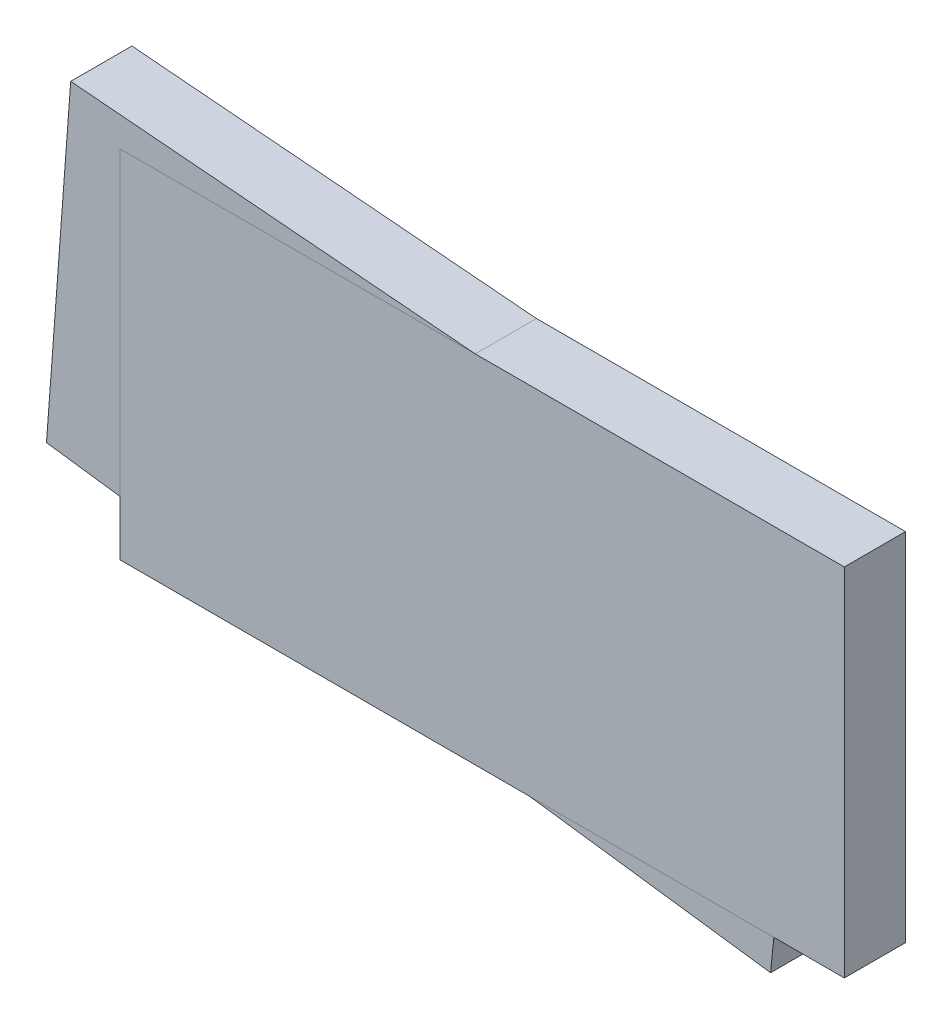
ISO-10303-21;
HEADER;
FILE_DESCRIPTION(('STEP AP214'),'2;1');
FILE_NAME('part.step','',(''),(''),'','','');
FILE_SCHEMA(('AUTOMOTIVE_DESIGN { 1 0 10303 214 1 1 1 1 }'));
ENDSEC;
DATA;
#1=APPLICATION_CONTEXT('core data for automotive mechanical design processes');
#2=APPLICATION_PROTOCOL_DEFINITION('international standard','automotive_design',2000,#1);
#3=PRODUCT_CONTEXT('',#1,'mechanical');
#4=PRODUCT('Part','Part','',(#3));
#5=PRODUCT_RELATED_PRODUCT_CATEGORY('part','',(#4));
#6=PRODUCT_DEFINITION_FORMATION('','',#4);
#7=PRODUCT_DEFINITION_CONTEXT('part definition',#1,'design');
#8=PRODUCT_DEFINITION('design','',#6,#7);
#9=PRODUCT_DEFINITION_SHAPE('','',#8);
#10=(LENGTH_UNIT() NAMED_UNIT(*) SI_UNIT(.MILLI.,.METRE.));
#11=(NAMED_UNIT(*) PLANE_ANGLE_UNIT() SI_UNIT($,.RADIAN.));
#12=(NAMED_UNIT(*) SI_UNIT($,.STERADIAN.) SOLID_ANGLE_UNIT());
#13=UNCERTAINTY_MEASURE_WITH_UNIT(LENGTH_MEASURE(1.E-05),#10,'distance_accuracy_value','');
#14=(GEOMETRIC_REPRESENTATION_CONTEXT(3) GLOBAL_UNCERTAINTY_ASSIGNED_CONTEXT((#13)) GLOBAL_UNIT_ASSIGNED_CONTEXT((#10,
#11,#12)) REPRESENTATION_CONTEXT('',''));
#15=CARTESIAN_POINT('',(0.,0.,0.));
#16=DIRECTION('',(0.,0.,1.));
#17=DIRECTION('',(1.,0.,0.));
#18=AXIS2_PLACEMENT_3D('',#15,#16,#17);
#19=CARTESIAN_POINT('',(-106.737683760044,-27.7477647063634,15.));
#20=DIRECTION('',(0.132833476790361,0.991138369474103,0.));
#21=DIRECTION('',(-0.991138369474103,0.132833476790361,0.));
#22=AXIS2_PLACEMENT_3D('',#19,#20,#21);
#23=PLANE('',#22);
#24=DIRECTION('',(0.991138369474104,-0.132833476790361,0.));
#25=VECTOR('',#24,1.);
#26=CARTESIAN_POINT('',(-106.737683760044,-27.7477647063634,0.));
#27=LINE('',#26,#25);
#28=CARTESIAN_POINT('',(-106.737683760044,-27.7477647063634,0.));
#29=VERTEX_POINT('',#28);
#30=CARTESIAN_POINT('',(70.668259518707,-51.5239083557046,0.));
#31=VERTEX_POINT('',#30);
#32=EDGE_CURVE('E114',#29,#31,#27,.T.);
#33=ORIENTED_EDGE('',*,*,#32,.T.);
#34=DIRECTION('',(0.,0.,-1.));
#35=VECTOR('',#34,1.);
#36=CARTESIAN_POINT('',(70.668259518707,-51.5239083557046,15.));
#37=LINE('',#36,#35);
#38=CARTESIAN_POINT('',(70.668259518707,-51.5239083557046,15.));
#39=VERTEX_POINT('',#38);
#40=EDGE_CURVE('E12',#39,#31,#37,.T.);
#41=ORIENTED_EDGE('',*,*,#40,.F.);
#42=DIRECTION('',(0.991138369474104,-0.132833476790361,0.));
#43=VECTOR('',#42,1.);
#44=CARTESIAN_POINT('',(-106.737683760044,-27.7477647063634,15.));
#45=LINE('',#44,#43);
#46=CARTESIAN_POINT('',(-106.737683760044,-27.7477647063634,15.));
#47=VERTEX_POINT('',#46);
#48=EDGE_CURVE('E102',#47,#39,#45,.T.);
#49=ORIENTED_EDGE('',*,*,#48,.F.);
#50=DIRECTION('',(0.,0.,-1.));
#51=VECTOR('',#50,1.);
#52=CARTESIAN_POINT('',(-106.737683760044,-27.7477647063634,15.));
#53=LINE('',#52,#51);
#54=EDGE_CURVE('E110',#47,#29,#53,.T.);
#55=ORIENTED_EDGE('',*,*,#54,.T.);
#56=EDGE_LOOP('',(#33,#41,#49,#55));
#57=FACE_BOUND('',#56,.T.);
#58=ADVANCED_FACE('F51',(#57),#23,.F.);
#59=CARTESIAN_POINT('',(70.668259518707,-51.5239083557046,15.));
#60=DIRECTION('',(-0.994913236999188,0.100735549056916,0.));
#61=DIRECTION('',(-0.100735549056916,-0.994913236999188,0.));
#62=AXIS2_PLACEMENT_3D('',#59,#60,#61);
#63=PLANE('',#62);
#64=DIRECTION('',(0.100735549056916,0.994913236999188,0.));
#65=VECTOR('',#64,1.);
#66=CARTESIAN_POINT('',(70.668259518707,-51.5239083557046,0.));
#67=LINE('',#66,#65);
#68=CARTESIAN_POINT('',(79.6138617800502,36.8272068768295,0.));
#69=VERTEX_POINT('',#68);
#70=EDGE_CURVE('E106',#31,#69,#67,.T.);
#71=ORIENTED_EDGE('',*,*,#70,.T.);
#72=DIRECTION('',(0.,0.,-1.));
#73=VECTOR('',#72,1.);
#74=CARTESIAN_POINT('',(79.6138617800502,36.8272068768295,15.));
#75=LINE('',#74,#73);
#76=CARTESIAN_POINT('',(79.6138617800502,36.8272068768295,15.));
#77=VERTEX_POINT('',#76);
#78=EDGE_CURVE('E59',#77,#69,#75,.T.);
#79=ORIENTED_EDGE('',*,*,#78,.F.);
#80=DIRECTION('',(0.100735549056916,0.994913236999188,0.));
#81=VECTOR('',#80,1.);
#82=CARTESIAN_POINT('',(70.668259518707,-51.5239083557046,15.));
#83=LINE('',#82,#81);
#84=EDGE_CURVE('E97',#39,#77,#83,.T.);
#85=ORIENTED_EDGE('',*,*,#84,.F.);
#86=ORIENTED_EDGE('',*,*,#40,.T.);
#87=EDGE_LOOP('',(#71,#79,#85,#86));
#88=FACE_BOUND('',#87,.T.);
#89=ADVANCED_FACE('F105',(#88),#63,.F.);
#90=CARTESIAN_POINT('',(79.6138617800502,36.8272068768295,15.));
#91=DIRECTION('',(-0.0831094991430913,-0.996540421233471,0.));
#92=DIRECTION('',(0.996540421233471,-0.0831094991430913,0.));
#93=AXIS2_PLACEMENT_3D('',#90,#91,#92);
#94=PLANE('',#93);
#95=DIRECTION('',(-0.996540421233471,0.0831094991430913,0.));
#96=VECTOR('',#95,1.);
#97=CARTESIAN_POINT('',(79.6138617800502,36.8272068768295,0.));
#98=LINE('',#97,#96);
#99=CARTESIAN_POINT('',(-100.800517252862,51.8734090781192,0.));
#100=VERTEX_POINT('',#99);
#101=EDGE_CURVE('E84',#69,#100,#98,.T.);
#102=ORIENTED_EDGE('',*,*,#101,.T.);
#103=DIRECTION('',(0.,0.,-1.));
#104=VECTOR('',#103,1.);
#105=CARTESIAN_POINT('',(-100.800517252862,51.8734090781192,15.));
#106=LINE('',#105,#104);
#107=CARTESIAN_POINT('',(-100.800517252862,51.8734090781192,15.));
#108=VERTEX_POINT('',#107);
#109=EDGE_CURVE('E107',#108,#100,#106,.T.);
#110=ORIENTED_EDGE('',*,*,#109,.F.);
#111=DIRECTION('',(-0.996540421233471,0.0831094991430913,0.));
#112=VECTOR('',#111,1.);
#113=CARTESIAN_POINT('',(79.6138617800502,36.8272068768295,15.));
#114=LINE('',#113,#112);
#115=EDGE_CURVE('E100',#77,#108,#114,.T.);
#116=ORIENTED_EDGE('',*,*,#115,.F.);
#117=ORIENTED_EDGE('',*,*,#78,.T.);
#118=EDGE_LOOP('',(#102,#110,#116,#117));
#119=FACE_BOUND('',#118,.T.);
#120=ADVANCED_FACE('F108',(#119),#94,.F.);
#121=CARTESIAN_POINT('',(-100.800517252862,51.8734090781192,15.));
#122=DIRECTION('',(0.997231370822952,-0.0743612334928296,0.));
#123=DIRECTION('',(0.0743612334928296,0.997231370822953,0.));
#124=AXIS2_PLACEMENT_3D('',#121,#122,#123);
#125=PLANE('',#124);
#126=DIRECTION('',(-0.0743612334928296,-0.997231370822952,0.));
#127=VECTOR('',#126,1.);
#128=CARTESIAN_POINT('',(-100.800517252862,51.8734090781192,0.));
#129=LINE('',#128,#127);
#130=EDGE_CURVE('E90',#100,#29,#129,.T.);
#131=ORIENTED_EDGE('',*,*,#130,.T.);
#132=ORIENTED_EDGE('',*,*,#54,.F.);
#133=DIRECTION('',(-0.0743612334928296,-0.997231370822952,0.));
#134=VECTOR('',#133,1.);
#135=CARTESIAN_POINT('',(-100.800517252862,51.8734090781192,15.));
#136=LINE('',#135,#134);
#137=EDGE_CURVE('E67',#108,#47,#136,.T.);
#138=ORIENTED_EDGE('',*,*,#137,.F.);
#139=ORIENTED_EDGE('',*,*,#109,.T.);
#140=EDGE_LOOP('',(#131,#132,#138,#139));
#141=FACE_BOUND('',#140,.T.);
#142=ADVANCED_FACE('F121',(#141),#125,.F.);
#143=CARTESIAN_POINT('',(0.,0.,15.));
#144=DIRECTION('',(0.,0.,1.));
#145=DIRECTION('',(1.,0.,0.));
#146=AXIS2_PLACEMENT_3D('',#143,#144,#145);
#147=PLANE('',#146);
#148=ORIENTED_EDGE('',*,*,#48,.T.);
#149=ORIENTED_EDGE('',*,*,#84,.T.);
#150=ORIENTED_EDGE('',*,*,#115,.T.);
#151=ORIENTED_EDGE('',*,*,#137,.T.);
#152=EDGE_LOOP('',(#148,#149,#150,#151));
#153=FACE_BOUND('',#152,.T.);
#154=ADVANCED_FACE('F98',(#153),#147,.T.);
#155=CARTESIAN_POINT('',(0.,0.,0.));
#156=DIRECTION('',(0.,0.,1.));
#157=DIRECTION('',(1.,0.,0.));
#158=AXIS2_PLACEMENT_3D('',#155,#156,#157);
#159=PLANE('',#158);
#160=ORIENTED_EDGE('',*,*,#32,.F.);
#161=ORIENTED_EDGE('',*,*,#130,.F.);
#162=ORIENTED_EDGE('',*,*,#101,.F.);
#163=ORIENTED_EDGE('',*,*,#70,.F.);
#164=EDGE_LOOP('',(#160,#161,#162,#163));
#165=FACE_BOUND('',#164,.T.);
#166=ADVANCED_FACE('F124',(#165),#159,.F.);
#167=CLOSED_SHELL('',(#58,#89,#120,#142,#154,#166));
#168=MANIFOLD_SOLID_BREP('B2',#167);
#169=CARTESIAN_POINT('',(88.7321912553851,-43.6075247524752,15.));
#170=DIRECTION('',(-1.,0.,0.));
#171=DIRECTION('',(0.,0.,1.));
#172=AXIS2_PLACEMENT_3D('',#169,#170,#171);
#173=PLANE('',#172);
#174=DIRECTION('',(0.,1.,0.));
#175=VECTOR('',#174,1.);
#176=CARTESIAN_POINT('',(88.7321912553851,-43.6075247524752,0.));
#177=LINE('',#176,#175);
#178=CARTESIAN_POINT('',(88.7321912553851,-43.6075247524752,0.));
#179=VERTEX_POINT('',#178);
#180=CARTESIAN_POINT('',(88.7321912553851,43.6075247524752,0.));
#181=VERTEX_POINT('',#180);
#182=EDGE_CURVE('E239',#179,#181,#177,.T.);
#183=ORIENTED_EDGE('',*,*,#182,.T.);
#184=DIRECTION('',(0.,0.,-1.));
#185=VECTOR('',#184,1.);
#186=CARTESIAN_POINT('',(88.7321912553851,43.6075247524752,15.));
#187=LINE('',#186,#185);
#188=CARTESIAN_POINT('',(88.7321912553851,43.6075247524752,15.));
#189=VERTEX_POINT('',#188);
#190=EDGE_CURVE('E49',#189,#181,#187,.T.);
#191=ORIENTED_EDGE('',*,*,#190,.F.);
#192=DIRECTION('',(0.,1.,0.));
#193=VECTOR('',#192,1.);
#194=CARTESIAN_POINT('',(88.7321912553851,-43.6075247524752,15.));
#195=LINE('',#194,#193);
#196=CARTESIAN_POINT('',(88.7321912553851,-43.6075247524752,15.));
#197=VERTEX_POINT('',#196);
#198=EDGE_CURVE('E226',#197,#189,#195,.T.);
#199=ORIENTED_EDGE('',*,*,#198,.F.);
#200=DIRECTION('',(0.,0.,-1.));
#201=VECTOR('',#200,1.);
#202=CARTESIAN_POINT('',(88.7321912553851,-43.6075247524752,15.));
#203=LINE('',#202,#201);
#204=EDGE_CURVE('E235',#197,#179,#203,.T.);
#205=ORIENTED_EDGE('',*,*,#204,.T.);
#206=EDGE_LOOP('',(#183,#191,#199,#205));
#207=FACE_BOUND('',#206,.T.);
#208=ADVANCED_FACE('F175',(#207),#173,.F.);
#209=CARTESIAN_POINT('',(-88.7321912553851,43.6075247524752,15.));
#210=DIRECTION('',(0.,-1.,0.));
#211=DIRECTION('',(0.,0.,-1.));
#212=AXIS2_PLACEMENT_3D('',#209,#210,#211);
#213=PLANE('',#212);
#214=DIRECTION('',(-1.,0.,0.));
#215=VECTOR('',#214,1.);
#216=CARTESIAN_POINT('',(-88.7321912553851,43.6075247524752,0.));
#217=LINE('',#216,#215);
#218=CARTESIAN_POINT('',(-88.7321912553851,43.6075247524752,0.));
#219=VERTEX_POINT('',#218);
#220=EDGE_CURVE('E230',#181,#219,#217,.T.);
#221=ORIENTED_EDGE('',*,*,#220,.T.);
#222=DIRECTION('',(0.,0.,-1.));
#223=VECTOR('',#222,1.);
#224=CARTESIAN_POINT('',(-88.7321912553851,43.6075247524752,15.));
#225=LINE('',#224,#223);
#226=CARTESIAN_POINT('',(-88.7321912553851,43.6075247524752,15.));
#227=VERTEX_POINT('',#226);
#228=EDGE_CURVE('E183',#227,#219,#225,.T.);
#229=ORIENTED_EDGE('',*,*,#228,.F.);
#230=DIRECTION('',(-1.,0.,0.));
#231=VECTOR('',#230,1.);
#232=CARTESIAN_POINT('',(-88.7321912553851,43.6075247524752,15.));
#233=LINE('',#232,#231);
#234=EDGE_CURVE('E221',#189,#227,#233,.T.);
#235=ORIENTED_EDGE('',*,*,#234,.F.);
#236=ORIENTED_EDGE('',*,*,#190,.T.);
#237=EDGE_LOOP('',(#221,#229,#235,#236));
#238=FACE_BOUND('',#237,.T.);
#239=ADVANCED_FACE('F229',(#238),#213,.F.);
#240=CARTESIAN_POINT('',(-88.7321912553851,-43.6075247524752,15.));
#241=DIRECTION('',(1.,0.,0.));
#242=DIRECTION('',(0.,0.,-1.));
#243=AXIS2_PLACEMENT_3D('',#240,#241,#242);
#244=PLANE('',#243);
#245=DIRECTION('',(0.,-1.,0.));
#246=VECTOR('',#245,1.);
#247=CARTESIAN_POINT('',(-88.7321912553851,-43.6075247524752,0.));
#248=LINE('',#247,#246);
#249=CARTESIAN_POINT('',(-88.7321912553851,-43.6075247524752,0.));
#250=VERTEX_POINT('',#249);
#251=EDGE_CURVE('E208',#219,#250,#248,.T.);
#252=ORIENTED_EDGE('',*,*,#251,.T.);
#253=DIRECTION('',(0.,0.,-1.));
#254=VECTOR('',#253,1.);
#255=CARTESIAN_POINT('',(-88.7321912553851,-43.6075247524752,15.));
#256=LINE('',#255,#254);
#257=CARTESIAN_POINT('',(-88.7321912553851,-43.6075247524752,15.));
#258=VERTEX_POINT('',#257);
#259=EDGE_CURVE('E231',#258,#250,#256,.T.);
#260=ORIENTED_EDGE('',*,*,#259,.F.);
#261=DIRECTION('',(0.,-1.,0.));
#262=VECTOR('',#261,1.);
#263=CARTESIAN_POINT('',(-88.7321912553851,-43.6075247524752,15.));
#264=LINE('',#263,#262);
#265=EDGE_CURVE('E224',#227,#258,#264,.T.);
#266=ORIENTED_EDGE('',*,*,#265,.F.);
#267=ORIENTED_EDGE('',*,*,#228,.T.);
#268=EDGE_LOOP('',(#252,#260,#266,#267));
#269=FACE_BOUND('',#268,.T.);
#270=ADVANCED_FACE('F232',(#269),#244,.F.);
#271=CARTESIAN_POINT('',(-88.7321912553851,-43.6075247524752,15.));
#272=DIRECTION('',(0.,1.,0.));
#273=DIRECTION('',(0.,0.,1.));
#274=AXIS2_PLACEMENT_3D('',#271,#272,#273);
#275=PLANE('',#274);
#276=DIRECTION('',(1.,0.,0.));
#277=VECTOR('',#276,1.);
#278=CARTESIAN_POINT('',(-88.7321912553851,-43.6075247524752,0.));
#279=LINE('',#278,#277);
#280=EDGE_CURVE('E214',#250,#179,#279,.T.);
#281=ORIENTED_EDGE('',*,*,#280,.T.);
#282=ORIENTED_EDGE('',*,*,#204,.F.);
#283=DIRECTION('',(1.,0.,0.));
#284=VECTOR('',#283,1.);
#285=CARTESIAN_POINT('',(-88.7321912553851,-43.6075247524752,15.));
#286=LINE('',#285,#284);
#287=EDGE_CURVE('E191',#258,#197,#286,.T.);
#288=ORIENTED_EDGE('',*,*,#287,.F.);
#289=ORIENTED_EDGE('',*,*,#259,.T.);
#290=EDGE_LOOP('',(#281,#282,#288,#289));
#291=FACE_BOUND('',#290,.T.);
#292=ADVANCED_FACE('F247',(#291),#275,.F.);
#293=CARTESIAN_POINT('',(0.,0.,15.));
#294=DIRECTION('',(0.,0.,-1.));
#295=DIRECTION('',(-1.,0.,0.));
#296=AXIS2_PLACEMENT_3D('',#293,#294,#295);
#297=PLANE('',#296);
#298=ORIENTED_EDGE('',*,*,#198,.T.);
#299=ORIENTED_EDGE('',*,*,#234,.T.);
#300=ORIENTED_EDGE('',*,*,#265,.T.);
#301=ORIENTED_EDGE('',*,*,#287,.T.);
#302=EDGE_LOOP('',(#298,#299,#300,#301));
#303=FACE_BOUND('',#302,.T.);
#304=ADVANCED_FACE('F222',(#303),#297,.F.);
#305=CARTESIAN_POINT('',(0.,0.,0.));
#306=DIRECTION('',(0.,0.,-1.));
#307=DIRECTION('',(-1.,0.,0.));
#308=AXIS2_PLACEMENT_3D('',#305,#306,#307);
#309=PLANE('',#308);
#310=ORIENTED_EDGE('',*,*,#182,.F.);
#311=ORIENTED_EDGE('',*,*,#280,.F.);
#312=ORIENTED_EDGE('',*,*,#251,.F.);
#313=ORIENTED_EDGE('',*,*,#220,.F.);
#314=EDGE_LOOP('',(#310,#311,#312,#313));
#315=FACE_BOUND('',#314,.T.);
#316=ADVANCED_FACE('F250',(#315),#309,.T.);
#317=CLOSED_SHELL('',(#208,#239,#270,#292,#304,#316));
#318=MANIFOLD_SOLID_BREP('B6',#317);
#319=ADVANCED_BREP_SHAPE_REPRESENTATION('',(#18,#168,#318),#14);
#320=SHAPE_DEFINITION_REPRESENTATION(#9,#319);
ENDSEC;
END-ISO-10303-21;
